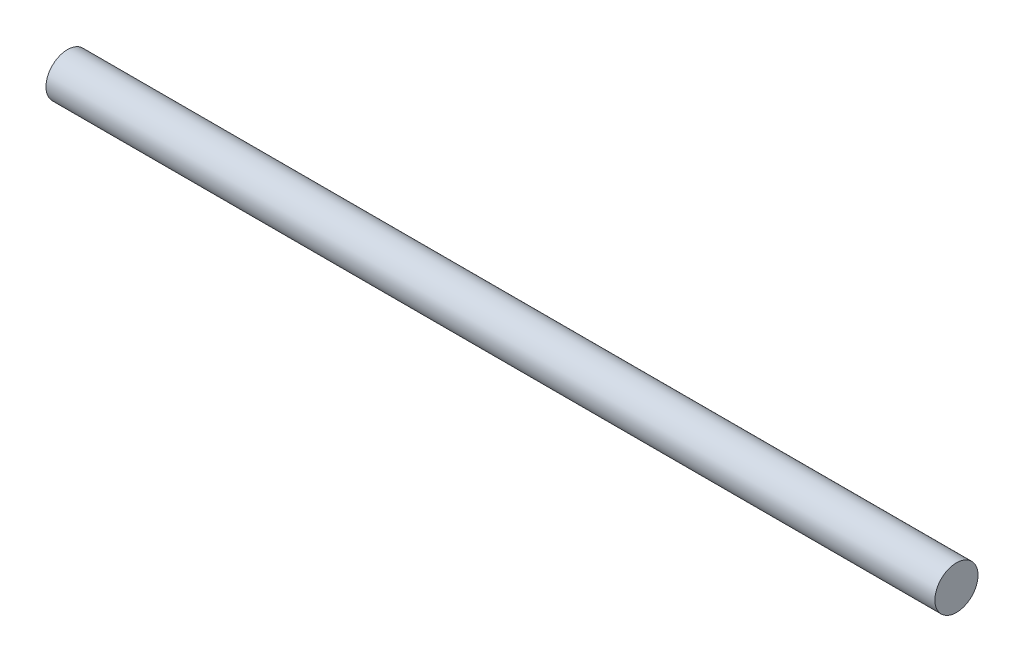
ISO-10303-21;
HEADER;
FILE_DESCRIPTION(('STEP AP214'),'2;1');
FILE_NAME('part.step','',(''),(''),'','','');
FILE_SCHEMA(('AUTOMOTIVE_DESIGN { 1 0 10303 214 1 1 1 1 }'));
ENDSEC;
DATA;
#1=APPLICATION_CONTEXT('core data for automotive mechanical design processes');
#2=APPLICATION_PROTOCOL_DEFINITION('international standard','automotive_design',2000,#1);
#3=PRODUCT_CONTEXT('',#1,'mechanical');
#4=PRODUCT('Part','Part','',(#3));
#5=PRODUCT_RELATED_PRODUCT_CATEGORY('part','',(#4));
#6=PRODUCT_DEFINITION_FORMATION('','',#4);
#7=PRODUCT_DEFINITION_CONTEXT('part definition',#1,'design');
#8=PRODUCT_DEFINITION('design','',#6,#7);
#9=PRODUCT_DEFINITION_SHAPE('','',#8);
#10=(LENGTH_UNIT() NAMED_UNIT(*) SI_UNIT(.MILLI.,.METRE.));
#11=(NAMED_UNIT(*) PLANE_ANGLE_UNIT() SI_UNIT($,.RADIAN.));
#12=(NAMED_UNIT(*) SI_UNIT($,.STERADIAN.) SOLID_ANGLE_UNIT());
#13=UNCERTAINTY_MEASURE_WITH_UNIT(LENGTH_MEASURE(1.E-05),#10,'distance_accuracy_value','');
#14=(GEOMETRIC_REPRESENTATION_CONTEXT(3) GLOBAL_UNCERTAINTY_ASSIGNED_CONTEXT((#13)) GLOBAL_UNIT_ASSIGNED_CONTEXT((#10,
#11,#12)) REPRESENTATION_CONTEXT('',''));
#15=CARTESIAN_POINT('',(0.,0.,0.));
#16=DIRECTION('',(0.,0.,1.));
#17=DIRECTION('',(1.,0.,0.));
#18=AXIS2_PLACEMENT_3D('',#15,#16,#17);
#19=CARTESIAN_POINT('',(82.5,0.,0.));
#20=DIRECTION('',(-1.,0.,0.));
#21=DIRECTION('',(0.,0.,1.));
#22=AXIS2_PLACEMENT_3D('',#19,#20,#21);
#23=CYLINDRICAL_SURFACE('',#22,4.);
#24=CARTESIAN_POINT('',(82.5,0.,0.));
#25=DIRECTION('',(1.,0.,0.));
#26=DIRECTION('',(0.,0.,-1.));
#27=AXIS2_PLACEMENT_3D('',#24,#25,#26);
#28=CIRCLE('',#27,4.);
#29=CARTESIAN_POINT('',(82.5,0.,-4.));
#30=VERTEX_POINT('',#29);
#31=EDGE_CURVE('E10',#30,#30,#28,.T.);
#32=ORIENTED_EDGE('',*,*,#31,.F.);
#33=EDGE_LOOP('',(#32));
#34=FACE_BOUND('',#33,.T.);
#35=CARTESIAN_POINT('',(-82.5,0.,0.));
#36=DIRECTION('',(1.,0.,0.));
#37=DIRECTION('',(0.,0.,-1.));
#38=AXIS2_PLACEMENT_3D('',#35,#36,#37);
#39=CIRCLE('',#38,4.);
#40=CARTESIAN_POINT('',(-82.5,0.,-4.));
#41=VERTEX_POINT('',#40);
#42=EDGE_CURVE('E36',#41,#41,#39,.T.);
#43=ORIENTED_EDGE('',*,*,#42,.T.);
#44=EDGE_LOOP('',(#43));
#45=FACE_BOUND('',#44,.T.);
#46=ADVANCED_FACE('F33',(#34,#45),#23,.T.);
#47=CARTESIAN_POINT('',(82.5,0.,0.));
#48=DIRECTION('',(1.,0.,0.));
#49=DIRECTION('',(0.,0.,-1.));
#50=AXIS2_PLACEMENT_3D('',#47,#48,#49);
#51=PLANE('',#50);
#52=ORIENTED_EDGE('',*,*,#31,.T.);
#53=EDGE_LOOP('',(#52));
#54=FACE_BOUND('',#53,.T.);
#55=ADVANCED_FACE('F48',(#54),#51,.T.);
#56=CARTESIAN_POINT('',(-82.5,0.,0.));
#57=DIRECTION('',(1.,0.,0.));
#58=DIRECTION('',(0.,0.,-1.));
#59=AXIS2_PLACEMENT_3D('',#56,#57,#58);
#60=PLANE('',#59);
#61=ORIENTED_EDGE('',*,*,#42,.F.);
#62=EDGE_LOOP('',(#61));
#63=FACE_BOUND('',#62,.T.);
#64=ADVANCED_FACE('F46',(#63),#60,.F.);
#65=CLOSED_SHELL('',(#46,#55,#64));
#66=MANIFOLD_SOLID_BREP('B2',#65);
#67=ADVANCED_BREP_SHAPE_REPRESENTATION('',(#18,#66),#14);
#68=SHAPE_DEFINITION_REPRESENTATION(#9,#67);
ENDSEC;
END-ISO-10303-21;
